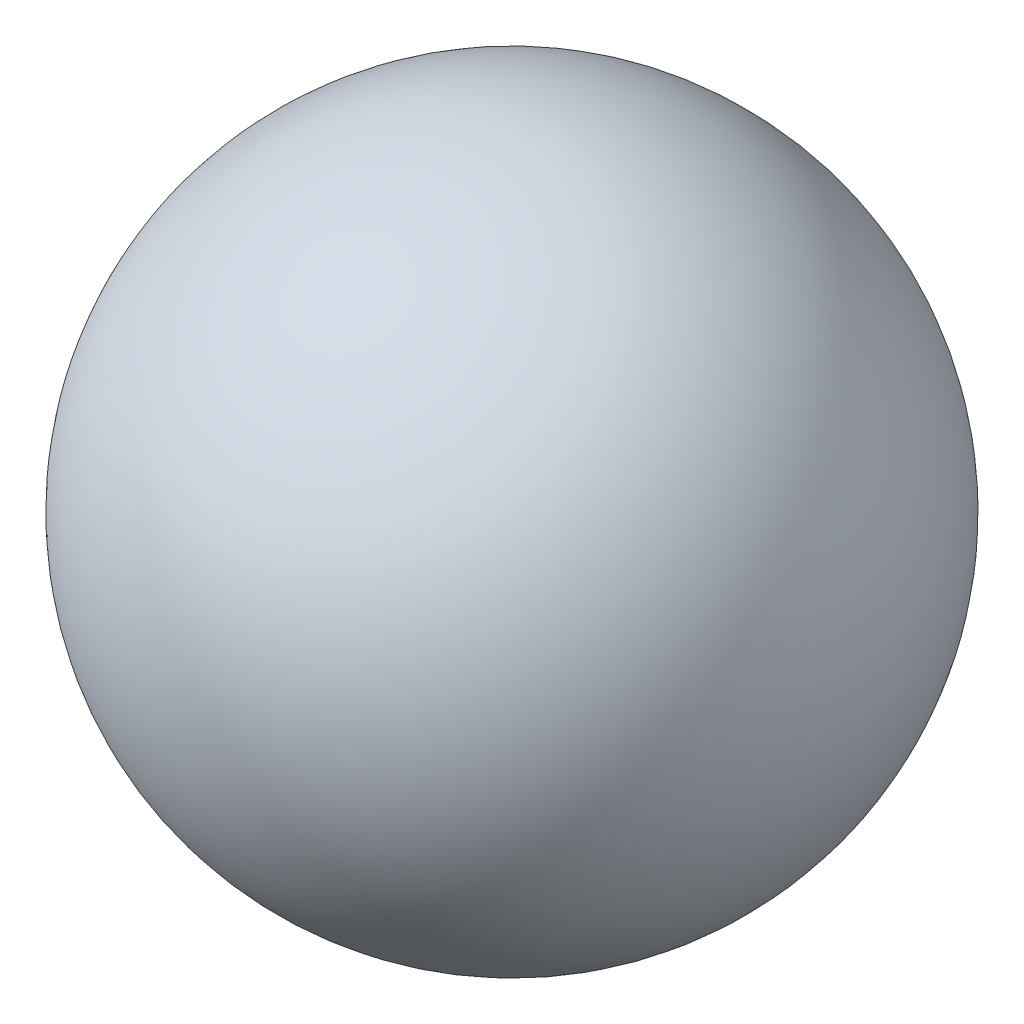
ISO-10303-21;
HEADER;
FILE_DESCRIPTION(('STEP AP214'),'2;1');
FILE_NAME('part.step','',(''),(''),'','','');
FILE_SCHEMA(('AUTOMOTIVE_DESIGN { 1 0 10303 214 1 1 1 1 }'));
ENDSEC;
DATA;
#1=APPLICATION_CONTEXT('core data for automotive mechanical design processes');
#2=APPLICATION_PROTOCOL_DEFINITION('international standard','automotive_design',2000,#1);
#3=PRODUCT_CONTEXT('',#1,'mechanical');
#4=PRODUCT('Part','Part','',(#3));
#5=PRODUCT_RELATED_PRODUCT_CATEGORY('part','',(#4));
#6=PRODUCT_DEFINITION_FORMATION('','',#4);
#7=PRODUCT_DEFINITION_CONTEXT('part definition',#1,'design');
#8=PRODUCT_DEFINITION('design','',#6,#7);
#9=PRODUCT_DEFINITION_SHAPE('','',#8);
#10=(LENGTH_UNIT() NAMED_UNIT(*) SI_UNIT(.MILLI.,.METRE.));
#11=(NAMED_UNIT(*) PLANE_ANGLE_UNIT() SI_UNIT($,.RADIAN.));
#12=(NAMED_UNIT(*) SI_UNIT($,.STERADIAN.) SOLID_ANGLE_UNIT());
#13=UNCERTAINTY_MEASURE_WITH_UNIT(LENGTH_MEASURE(1.E-05),#10,'distance_accuracy_value','');
#14=(GEOMETRIC_REPRESENTATION_CONTEXT(3) GLOBAL_UNCERTAINTY_ASSIGNED_CONTEXT((#13)) GLOBAL_UNIT_ASSIGNED_CONTEXT((#10,
#11,#12)) REPRESENTATION_CONTEXT('',''));
#15=CARTESIAN_POINT('',(0.,0.,0.));
#16=DIRECTION('',(0.,0.,1.));
#17=DIRECTION('',(1.,0.,0.));
#18=AXIS2_PLACEMENT_3D('',#15,#16,#17);
#19=CARTESIAN_POINT('',(0.,0.,0.));
#20=DIRECTION('',(-1.,0.,0.));
#21=DIRECTION('',(0.,1.,0.));
#22=AXIS2_PLACEMENT_3D('',#19,#20,#21);
#23=SPHERICAL_SURFACE('',#22,19.939);
#24=CARTESIAN_POINT('',(-19.939,0.,0.));
#25=VERTEX_POINT('',#24);
#26=VERTEX_LOOP('',#25);
#27=FACE_BOUND('',#26,.T.);
#28=ADVANCED_FACE('F31',(#27),#23,.T.);
#29=CLOSED_SHELL('',(#28));
#30=MANIFOLD_SOLID_BREP('B2',#29);
#31=ADVANCED_BREP_SHAPE_REPRESENTATION('',(#18,#30),#14);
#32=SHAPE_DEFINITION_REPRESENTATION(#9,#31);
ENDSEC;
END-ISO-10303-21;
